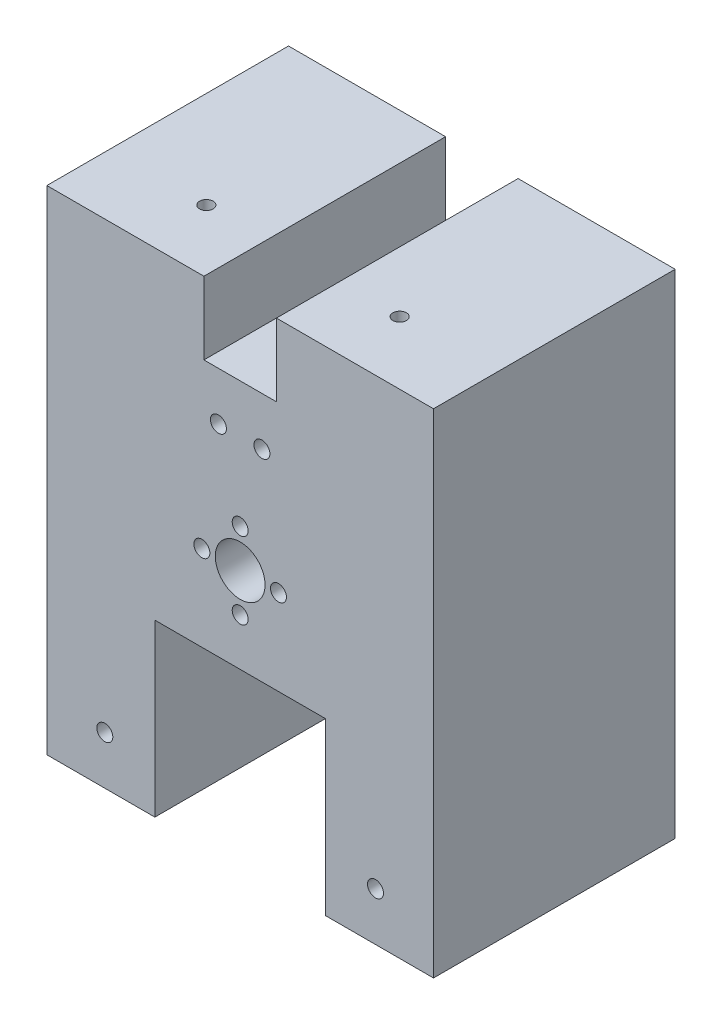
ISO-10303-21;
HEADER;
FILE_DESCRIPTION(('STEP AP214'),'2;1');
FILE_NAME('part.step','',(''),(''),'','','');
FILE_SCHEMA(('AUTOMOTIVE_DESIGN { 1 0 10303 214 1 1 1 1 }'));
ENDSEC;
DATA;
#1=APPLICATION_CONTEXT('core data for automotive mechanical design processes');
#2=APPLICATION_PROTOCOL_DEFINITION('international standard','automotive_design',2000,#1);
#3=PRODUCT_CONTEXT('',#1,'mechanical');
#4=PRODUCT('Part','Part','',(#3));
#5=PRODUCT_RELATED_PRODUCT_CATEGORY('part','',(#4));
#6=PRODUCT_DEFINITION_FORMATION('','',#4);
#7=PRODUCT_DEFINITION_CONTEXT('part definition',#1,'design');
#8=PRODUCT_DEFINITION('design','',#6,#7);
#9=PRODUCT_DEFINITION_SHAPE('','',#8);
#10=(LENGTH_UNIT() NAMED_UNIT(*) SI_UNIT(.MILLI.,.METRE.));
#11=(NAMED_UNIT(*) PLANE_ANGLE_UNIT() SI_UNIT($,.RADIAN.));
#12=(NAMED_UNIT(*) SI_UNIT($,.STERADIAN.) SOLID_ANGLE_UNIT());
#13=UNCERTAINTY_MEASURE_WITH_UNIT(LENGTH_MEASURE(1.E-05),#10,'distance_accuracy_value','');
#14=(GEOMETRIC_REPRESENTATION_CONTEXT(3) GLOBAL_UNCERTAINTY_ASSIGNED_CONTEXT((#13)) GLOBAL_UNIT_ASSIGNED_CONTEXT((#10,
#11,#12)) REPRESENTATION_CONTEXT('',''));
#15=CARTESIAN_POINT('',(0.,0.,0.));
#16=DIRECTION('',(0.,0.,1.));
#17=DIRECTION('',(1.,0.,0.));
#18=AXIS2_PLACEMENT_3D('',#15,#16,#17);
#19=CARTESIAN_POINT('',(-40.,-50.25,-9950.));
#20=DIRECTION('',(0.,1.,0.));
#21=DIRECTION('',(0.,0.,1.));
#22=AXIS2_PLACEMENT_3D('',#19,#20,#21);
#23=PLANE('',#22);
#24=DIRECTION('',(0.,0.,1.));
#25=VECTOR('',#24,1.);
#26=CARTESIAN_POINT('',(17.65,-50.25,-950.));
#27=LINE('',#26,#25);
#28=CARTESIAN_POINT('',(17.65,-50.25,0.));
#29=VERTEX_POINT('',#28);
#30=CARTESIAN_POINT('',(17.65,-50.25,50.));
#31=VERTEX_POINT('',#30);
#32=EDGE_CURVE('E152',#29,#31,#27,.T.);
#33=ORIENTED_EDGE('',*,*,#32,.F.);
#34=DIRECTION('',(1.,0.,0.));
#35=VECTOR('',#34,1.);
#36=CARTESIAN_POINT('',(0.,-50.25,0.));
#37=LINE('',#36,#35);
#38=CARTESIAN_POINT('',(40.,-50.25,0.));
#39=VERTEX_POINT('',#38);
#40=EDGE_CURVE('E298',#29,#39,#37,.T.);
#41=ORIENTED_EDGE('',*,*,#40,.T.);
#42=DIRECTION('',(0.,0.,1.));
#43=VECTOR('',#42,1.);
#44=CARTESIAN_POINT('',(40.,-50.25,-9950.));
#45=LINE('',#44,#43);
#46=CARTESIAN_POINT('',(40.,-50.25,50.));
#47=VERTEX_POINT('',#46);
#48=EDGE_CURVE('E178',#39,#47,#45,.T.);
#49=ORIENTED_EDGE('',*,*,#48,.T.);
#50=DIRECTION('',(-1.,0.,0.));
#51=VECTOR('',#50,1.);
#52=CARTESIAN_POINT('',(-40.,-50.25,50.));
#53=LINE('',#52,#51);
#54=EDGE_CURVE('E174',#47,#31,#53,.T.);
#55=ORIENTED_EDGE('',*,*,#54,.T.);
#56=EDGE_LOOP('',(#33,#41,#49,#55));
#57=FACE_BOUND('',#56,.T.);
#58=ADVANCED_FACE('F44',(#57),#23,.F.);
#59=CARTESIAN_POINT('',(0.,0.,50.));
#60=DIRECTION('',(0.,0.,-1.));
#61=DIRECTION('',(-1.,0.,0.));
#62=AXIS2_PLACEMENT_3D('',#59,#60,#61);
#63=PLANE('',#62);
#64=CARTESIAN_POINT('',(28.,-40.25,50.));
#65=DIRECTION('',(0.,0.,1.));
#66=DIRECTION('',(1.,0.,0.));
#67=AXIS2_PLACEMENT_3D('',#64,#65,#66);
#68=CIRCLE('',#67,1.65);
#69=CARTESIAN_POINT('',(29.65,-40.25,50.));
#70=VERTEX_POINT('',#69);
#71=EDGE_CURVE('E314',#70,#70,#68,.T.);
#72=ORIENTED_EDGE('',*,*,#71,.F.);
#73=EDGE_LOOP('',(#72));
#74=FACE_BOUND('',#73,.T.);
#75=CARTESIAN_POINT('',(-28.,-40.25,50.));
#76=DIRECTION('',(0.,0.,1.));
#77=DIRECTION('',(1.,0.,0.));
#78=AXIS2_PLACEMENT_3D('',#75,#76,#77);
#79=CIRCLE('',#78,1.65);
#80=CARTESIAN_POINT('',(-26.35,-40.25,50.));
#81=VERTEX_POINT('',#80);
#82=EDGE_CURVE('E322',#81,#81,#79,.T.);
#83=ORIENTED_EDGE('',*,*,#82,.F.);
#84=EDGE_LOOP('',(#83));
#85=FACE_BOUND('',#84,.T.);
#86=CARTESIAN_POINT('',(0.,2.75,50.));
#87=DIRECTION('',(0.,0.,1.));
#88=DIRECTION('',(1.,0.,0.));
#89=AXIS2_PLACEMENT_3D('',#86,#87,#88);
#90=CIRCLE('',#89,5.15);
#91=CARTESIAN_POINT('',(5.15,2.75,50.));
#92=VERTEX_POINT('',#91);
#93=EDGE_CURVE('E181',#92,#92,#90,.T.);
#94=ORIENTED_EDGE('',*,*,#93,.F.);
#95=EDGE_LOOP('',(#94));
#96=FACE_BOUND('',#95,.T.);
#97=CARTESIAN_POINT('',(4.5,26.75,50.));
#98=DIRECTION('',(0.,0.,1.));
#99=DIRECTION('',(1.,0.,0.));
#100=AXIS2_PLACEMENT_3D('',#97,#98,#99);
#101=CIRCLE('',#100,1.65);
#102=CARTESIAN_POINT('',(6.15,26.75,50.));
#103=VERTEX_POINT('',#102);
#104=EDGE_CURVE('E189',#103,#103,#101,.T.);
#105=ORIENTED_EDGE('',*,*,#104,.F.);
#106=EDGE_LOOP('',(#105));
#107=FACE_BOUND('',#106,.T.);
#108=CARTESIAN_POINT('',(-4.5,26.75,50.));
#109=DIRECTION('',(0.,0.,1.));
#110=DIRECTION('',(1.,0.,0.));
#111=AXIS2_PLACEMENT_3D('',#108,#109,#110);
#112=CIRCLE('',#111,1.65);
#113=CARTESIAN_POINT('',(-2.85,26.75,50.));
#114=VERTEX_POINT('',#113);
#115=EDGE_CURVE('E194',#114,#114,#112,.T.);
#116=ORIENTED_EDGE('',*,*,#115,.F.);
#117=EDGE_LOOP('',(#116));
#118=FACE_BOUND('',#117,.T.);
#119=CARTESIAN_POINT('',(0.,-5.175,50.));
#120=DIRECTION('',(0.,0.,1.));
#121=DIRECTION('',(1.,0.,0.));
#122=AXIS2_PLACEMENT_3D('',#119,#120,#121);
#123=CIRCLE('',#122,1.65);
#124=CARTESIAN_POINT('',(1.65,-5.175,50.));
#125=VERTEX_POINT('',#124);
#126=EDGE_CURVE('E214',#125,#125,#123,.T.);
#127=ORIENTED_EDGE('',*,*,#126,.F.);
#128=EDGE_LOOP('',(#127));
#129=FACE_BOUND('',#128,.T.);
#130=CARTESIAN_POINT('',(0.,10.675,50.));
#131=DIRECTION('',(0.,0.,1.));
#132=DIRECTION('',(1.,0.,0.));
#133=AXIS2_PLACEMENT_3D('',#130,#131,#132);
#134=CIRCLE('',#133,1.65);
#135=CARTESIAN_POINT('',(1.65,10.675,50.));
#136=VERTEX_POINT('',#135);
#137=EDGE_CURVE('E235',#136,#136,#134,.T.);
#138=ORIENTED_EDGE('',*,*,#137,.F.);
#139=EDGE_LOOP('',(#138));
#140=FACE_BOUND('',#139,.T.);
#141=CARTESIAN_POINT('',(-7.925,2.75,50.));
#142=DIRECTION('',(0.,0.,1.));
#143=DIRECTION('',(1.,0.,0.));
#144=AXIS2_PLACEMENT_3D('',#141,#142,#143);
#145=CIRCLE('',#144,1.65);
#146=CARTESIAN_POINT('',(-6.275,2.75,50.));
#147=VERTEX_POINT('',#146);
#148=EDGE_CURVE('E226',#147,#147,#145,.T.);
#149=ORIENTED_EDGE('',*,*,#148,.F.);
#150=EDGE_LOOP('',(#149));
#151=FACE_BOUND('',#150,.T.);
#152=CARTESIAN_POINT('',(7.925,2.75,50.));
#153=DIRECTION('',(0.,0.,1.));
#154=DIRECTION('',(1.,0.,0.));
#155=AXIS2_PLACEMENT_3D('',#152,#153,#154);
#156=CIRCLE('',#155,1.65);
#157=CARTESIAN_POINT('',(9.575,2.75,50.));
#158=VERTEX_POINT('',#157);
#159=EDGE_CURVE('E221',#158,#158,#156,.T.);
#160=ORIENTED_EDGE('',*,*,#159,.F.);
#161=EDGE_LOOP('',(#160));
#162=FACE_BOUND('',#161,.T.);
#163=DIRECTION('',(0.,1.,0.));
#164=VECTOR('',#163,1.);
#165=CARTESIAN_POINT('',(17.65,-14.95,50.));
#166=LINE('',#165,#164);
#167=CARTESIAN_POINT('',(17.65,-14.95,50.));
#168=VERTEX_POINT('',#167);
#169=EDGE_CURVE('E148',#31,#168,#166,.T.);
#170=ORIENTED_EDGE('',*,*,#169,.F.);
#171=ORIENTED_EDGE('',*,*,#54,.F.);
#172=DIRECTION('',(0.,1.,0.));
#173=VECTOR('',#172,1.);
#174=CARTESIAN_POINT('',(40.,-51.75,50.));
#175=LINE('',#174,#173);
#176=CARTESIAN_POINT('',(40.,51.75,50.));
#177=VERTEX_POINT('',#176);
#178=EDGE_CURVE('E237',#47,#177,#175,.T.);
#179=ORIENTED_EDGE('',*,*,#178,.T.);
#180=DIRECTION('',(-1.,0.,0.));
#181=VECTOR('',#180,1.);
#182=CARTESIAN_POINT('',(-40.,51.75,50.));
#183=LINE('',#182,#181);
#184=CARTESIAN_POINT('',(7.49999999999998,51.75,50.));
#185=VERTEX_POINT('',#184);
#186=EDGE_CURVE('E242',#177,#185,#183,.T.);
#187=ORIENTED_EDGE('',*,*,#186,.T.);
#188=DIRECTION('',(0.,1.,0.));
#189=VECTOR('',#188,1.);
#190=CARTESIAN_POINT('',(7.49999999999998,36.75,50.));
#191=LINE('',#190,#189);
#192=CARTESIAN_POINT('',(7.49999999999998,36.75,50.));
#193=VERTEX_POINT('',#192);
#194=EDGE_CURVE('E197',#193,#185,#191,.T.);
#195=ORIENTED_EDGE('',*,*,#194,.F.);
#196=DIRECTION('',(1.,0.,0.));
#197=VECTOR('',#196,1.);
#198=CARTESIAN_POINT('',(-7.50000000000002,36.75,50.));
#199=LINE('',#198,#197);
#200=CARTESIAN_POINT('',(-7.50000000000002,36.75,50.));
#201=VERTEX_POINT('',#200);
#202=EDGE_CURVE('E202',#201,#193,#199,.T.);
#203=ORIENTED_EDGE('',*,*,#202,.F.);
#204=DIRECTION('',(0.,-1.,0.));
#205=VECTOR('',#204,1.);
#206=CARTESIAN_POINT('',(-7.50000000000002,36.75,50.));
#207=LINE('',#206,#205);
#208=CARTESIAN_POINT('',(-7.50000000000002,51.75,50.));
#209=VERTEX_POINT('',#208);
#210=EDGE_CURVE('E200',#209,#201,#207,.T.);
#211=ORIENTED_EDGE('',*,*,#210,.F.);
#212=CARTESIAN_POINT('',(-40.,51.75,50.));
#213=VERTEX_POINT('',#212);
#214=EDGE_CURVE('E245',#209,#213,#183,.T.);
#215=ORIENTED_EDGE('',*,*,#214,.T.);
#216=DIRECTION('',(0.,-1.,0.));
#217=VECTOR('',#216,1.);
#218=CARTESIAN_POINT('',(-40.,-51.75,50.));
#219=LINE('',#218,#217);
#220=CARTESIAN_POINT('',(-40.,-50.25,50.));
#221=VERTEX_POINT('',#220);
#222=EDGE_CURVE('E247',#213,#221,#219,.T.);
#223=ORIENTED_EDGE('',*,*,#222,.T.);
#224=CARTESIAN_POINT('',(-17.65,-50.25,50.));
#225=VERTEX_POINT('',#224);
#226=EDGE_CURVE('E166',#225,#221,#53,.T.);
#227=ORIENTED_EDGE('',*,*,#226,.F.);
#228=DIRECTION('',(0.,-1.,0.));
#229=VECTOR('',#228,1.);
#230=CARTESIAN_POINT('',(-17.65,-14.95,50.));
#231=LINE('',#230,#229);
#232=CARTESIAN_POINT('',(-17.65,-14.95,50.));
#233=VERTEX_POINT('',#232);
#234=EDGE_CURVE('E146',#233,#225,#231,.T.);
#235=ORIENTED_EDGE('',*,*,#234,.F.);
#236=DIRECTION('',(-1.,0.,0.));
#237=VECTOR('',#236,1.);
#238=CARTESIAN_POINT('',(-17.65,-14.95,50.));
#239=LINE('',#238,#237);
#240=EDGE_CURVE('E139',#168,#233,#239,.T.);
#241=ORIENTED_EDGE('',*,*,#240,.F.);
#242=EDGE_LOOP('',(#170,#171,#179,#187,#195,#203,#211,#215,#223,#227,#235,#241));
#243=FACE_BOUND('',#242,.T.);
#244=ADVANCED_FACE('F156',(#74,#85,#96,#107,#118,#129,#140,#151,#162,#243),#63,.F.);
#245=CARTESIAN_POINT('',(40.,-51.75,50.));
#246=DIRECTION('',(-1.,0.,0.));
#247=DIRECTION('',(0.,0.,1.));
#248=AXIS2_PLACEMENT_3D('',#245,#246,#247);
#249=PLANE('',#248);
#250=ORIENTED_EDGE('',*,*,#48,.F.);
#251=DIRECTION('',(0.,1.,0.));
#252=VECTOR('',#251,1.);
#253=CARTESIAN_POINT('',(40.,-51.75,0.));
#254=LINE('',#253,#252);
#255=CARTESIAN_POINT('',(40.,51.75,0.));
#256=VERTEX_POINT('',#255);
#257=EDGE_CURVE('E254',#39,#256,#254,.T.);
#258=ORIENTED_EDGE('',*,*,#257,.T.);
#259=DIRECTION('',(0.,0.,-1.));
#260=VECTOR('',#259,1.);
#261=CARTESIAN_POINT('',(40.,51.75,50.));
#262=LINE('',#261,#260);
#263=EDGE_CURVE('E266',#177,#256,#262,.T.);
#264=ORIENTED_EDGE('',*,*,#263,.F.);
#265=ORIENTED_EDGE('',*,*,#178,.F.);
#266=EDGE_LOOP('',(#250,#258,#264,#265));
#267=FACE_BOUND('',#266,.T.);
#268=ADVANCED_FACE('F50',(#267),#249,.F.);
#269=CARTESIAN_POINT('',(-40.,51.75,50.));
#270=DIRECTION('',(0.,-1.,0.));
#271=DIRECTION('',(0.,0.,-1.));
#272=AXIS2_PLACEMENT_3D('',#269,#270,#271);
#273=PLANE('',#272);
#274=CARTESIAN_POINT('',(-20.,51.75,37.));
#275=DIRECTION('',(0.,1.,0.));
#276=DIRECTION('',(0.,0.,1.));
#277=AXIS2_PLACEMENT_3D('',#274,#275,#276);
#278=CIRCLE('',#277,1.4);
#279=CARTESIAN_POINT('',(-20.,51.75,38.4));
#280=VERTEX_POINT('',#279);
#281=EDGE_CURVE('E334',#280,#280,#278,.T.);
#282=ORIENTED_EDGE('',*,*,#281,.F.);
#283=EDGE_LOOP('',(#282));
#284=FACE_BOUND('',#283,.T.);
#285=DIRECTION('',(0.,0.,1.));
#286=VECTOR('',#285,1.);
#287=CARTESIAN_POINT('',(-7.50000000000002,51.75,-50.));
#288=LINE('',#287,#286);
#289=CARTESIAN_POINT('',(-7.50000000000002,51.75,0.));
#290=VERTEX_POINT('',#289);
#291=EDGE_CURVE('E217',#290,#209,#288,.T.);
#292=ORIENTED_EDGE('',*,*,#291,.F.);
#293=DIRECTION('',(-1.,0.,0.));
#294=VECTOR('',#293,1.);
#295=CARTESIAN_POINT('',(-40.,51.75,0.));
#296=LINE('',#295,#294);
#297=CARTESIAN_POINT('',(-40.,51.75,0.));
#298=VERTEX_POINT('',#297);
#299=EDGE_CURVE('E256',#290,#298,#296,.T.);
#300=ORIENTED_EDGE('',*,*,#299,.T.);
#301=DIRECTION('',(0.,0.,-1.));
#302=VECTOR('',#301,1.);
#303=CARTESIAN_POINT('',(-40.,51.75,50.));
#304=LINE('',#303,#302);
#305=EDGE_CURVE('E255',#213,#298,#304,.T.);
#306=ORIENTED_EDGE('',*,*,#305,.F.);
#307=ORIENTED_EDGE('',*,*,#214,.F.);
#308=EDGE_LOOP('',(#292,#300,#306,#307));
#309=FACE_BOUND('',#308,.T.);
#310=ADVANCED_FACE('F360',(#284,#309),#273,.F.);
#311=CARTESIAN_POINT('',(20.,51.75,37.));
#312=DIRECTION('',(0.,1.,0.));
#313=DIRECTION('',(0.,0.,1.));
#314=AXIS2_PLACEMENT_3D('',#311,#312,#313);
#315=CIRCLE('',#314,1.4);
#316=CARTESIAN_POINT('',(20.,51.75,38.4));
#317=VERTEX_POINT('',#316);
#318=EDGE_CURVE('E336',#317,#317,#315,.T.);
#319=ORIENTED_EDGE('',*,*,#318,.F.);
#320=EDGE_LOOP('',(#319));
#321=FACE_BOUND('',#320,.T.);
#322=CARTESIAN_POINT('',(7.49999999999998,51.75,0.));
#323=VERTEX_POINT('',#322);
#324=EDGE_CURVE('E259',#256,#323,#296,.T.);
#325=ORIENTED_EDGE('',*,*,#324,.T.);
#326=DIRECTION('',(0.,0.,1.));
#327=VECTOR('',#326,1.);
#328=CARTESIAN_POINT('',(7.49999999999998,51.75,-50.));
#329=LINE('',#328,#327);
#330=EDGE_CURVE('E209',#323,#185,#329,.T.);
#331=ORIENTED_EDGE('',*,*,#330,.T.);
#332=ORIENTED_EDGE('',*,*,#186,.F.);
#333=ORIENTED_EDGE('',*,*,#263,.T.);
#334=EDGE_LOOP('',(#325,#331,#332,#333));
#335=FACE_BOUND('',#334,.T.);
#336=ADVANCED_FACE('F352',(#321,#335),#273,.F.);
#337=CARTESIAN_POINT('',(-40.,-51.75,50.));
#338=DIRECTION('',(1.,0.,0.));
#339=DIRECTION('',(0.,0.,-1.));
#340=AXIS2_PLACEMENT_3D('',#337,#338,#339);
#341=PLANE('',#340);
#342=DIRECTION('',(0.,-1.,0.));
#343=VECTOR('',#342,1.);
#344=CARTESIAN_POINT('',(-40.,-51.75,0.));
#345=LINE('',#344,#343);
#346=CARTESIAN_POINT('',(-40.,-50.25,0.));
#347=VERTEX_POINT('',#346);
#348=EDGE_CURVE('E243',#298,#347,#345,.T.);
#349=ORIENTED_EDGE('',*,*,#348,.T.);
#350=DIRECTION('',(0.,0.,1.));
#351=VECTOR('',#350,1.);
#352=CARTESIAN_POINT('',(-40.,-50.25,-9950.));
#353=LINE('',#352,#351);
#354=EDGE_CURVE('E73',#347,#221,#353,.T.);
#355=ORIENTED_EDGE('',*,*,#354,.T.);
#356=ORIENTED_EDGE('',*,*,#222,.F.);
#357=ORIENTED_EDGE('',*,*,#305,.T.);
#358=EDGE_LOOP('',(#349,#355,#356,#357));
#359=FACE_BOUND('',#358,.T.);
#360=ADVANCED_FACE('F356',(#359),#341,.F.);
#361=CARTESIAN_POINT('',(0.,0.,0.));
#362=DIRECTION('',(0.,0.,-1.));
#363=DIRECTION('',(-1.,0.,0.));
#364=AXIS2_PLACEMENT_3D('',#361,#362,#363);
#365=PLANE('',#364);
#366=CARTESIAN_POINT('',(28.,-40.25,0.));
#367=DIRECTION('',(0.,0.,-1.));
#368=DIRECTION('',(-1.,0.,0.));
#369=AXIS2_PLACEMENT_3D('',#366,#367,#368);
#370=CIRCLE('',#369,1.65);
#371=CARTESIAN_POINT('',(26.35,-40.25,0.));
#372=VERTEX_POINT('',#371);
#373=EDGE_CURVE('E47',#372,#372,#370,.T.);
#374=ORIENTED_EDGE('',*,*,#373,.F.);
#375=EDGE_LOOP('',(#374));
#376=FACE_BOUND('',#375,.T.);
#377=CARTESIAN_POINT('',(-28.,-40.25,0.));
#378=DIRECTION('',(0.,0.,-1.));
#379=DIRECTION('',(-1.,0.,0.));
#380=AXIS2_PLACEMENT_3D('',#377,#378,#379);
#381=CIRCLE('',#380,1.65);
#382=CARTESIAN_POINT('',(-29.65,-40.25,0.));
#383=VERTEX_POINT('',#382);
#384=EDGE_CURVE('E315',#383,#383,#381,.T.);
#385=ORIENTED_EDGE('',*,*,#384,.F.);
#386=EDGE_LOOP('',(#385));
#387=FACE_BOUND('',#386,.T.);
#388=DIRECTION('',(0.,-1.,0.));
#389=VECTOR('',#388,1.);
#390=CARTESIAN_POINT('',(17.65,0.,0.));
#391=LINE('',#390,#389);
#392=CARTESIAN_POINT('',(17.65,-14.95,0.));
#393=VERTEX_POINT('',#392);
#394=EDGE_CURVE('E11',#393,#29,#391,.T.);
#395=ORIENTED_EDGE('',*,*,#394,.F.);
#396=DIRECTION('',(1.,0.,0.));
#397=VECTOR('',#396,1.);
#398=CARTESIAN_POINT('',(0.,-14.95,0.));
#399=LINE('',#398,#397);
#400=CARTESIAN_POINT('',(-17.65,-14.95,0.));
#401=VERTEX_POINT('',#400);
#402=EDGE_CURVE('E145',#401,#393,#399,.T.);
#403=ORIENTED_EDGE('',*,*,#402,.F.);
#404=DIRECTION('',(0.,1.,0.));
#405=VECTOR('',#404,1.);
#406=CARTESIAN_POINT('',(-17.65,0.,0.));
#407=LINE('',#406,#405);
#408=CARTESIAN_POINT('',(-17.65,-50.25,0.));
#409=VERTEX_POINT('',#408);
#410=EDGE_CURVE('E54',#409,#401,#407,.T.);
#411=ORIENTED_EDGE('',*,*,#410,.F.);
#412=EDGE_CURVE('E306',#347,#409,#37,.T.);
#413=ORIENTED_EDGE('',*,*,#412,.F.);
#414=ORIENTED_EDGE('',*,*,#348,.F.);
#415=ORIENTED_EDGE('',*,*,#299,.F.);
#416=DIRECTION('',(0.,1.,0.));
#417=VECTOR('',#416,1.);
#418=CARTESIAN_POINT('',(-7.50000000000002,0.,0.));
#419=LINE('',#418,#417);
#420=CARTESIAN_POINT('',(-7.50000000000002,36.75,0.));
#421=VERTEX_POINT('',#420);
#422=EDGE_CURVE('E275',#421,#290,#419,.T.);
#423=ORIENTED_EDGE('',*,*,#422,.F.);
#424=DIRECTION('',(-1.,0.,0.));
#425=VECTOR('',#424,1.);
#426=CARTESIAN_POINT('',(0.,36.75,0.));
#427=LINE('',#426,#425);
#428=CARTESIAN_POINT('',(7.49999999999998,36.75,0.));
#429=VERTEX_POINT('',#428);
#430=EDGE_CURVE('E289',#429,#421,#427,.T.);
#431=ORIENTED_EDGE('',*,*,#430,.F.);
#432=DIRECTION('',(0.,-1.,0.));
#433=VECTOR('',#432,1.);
#434=CARTESIAN_POINT('',(7.49999999999998,0.,0.));
#435=LINE('',#434,#433);
#436=EDGE_CURVE('E291',#323,#429,#435,.T.);
#437=ORIENTED_EDGE('',*,*,#436,.F.);
#438=ORIENTED_EDGE('',*,*,#324,.F.);
#439=ORIENTED_EDGE('',*,*,#257,.F.);
#440=ORIENTED_EDGE('',*,*,#40,.F.);
#441=EDGE_LOOP('',(#395,#403,#411,#413,#414,#415,#423,#431,#437,#438,#439,#440));
#442=FACE_BOUND('',#441,.T.);
#443=CARTESIAN_POINT('',(0.,2.75,0.));
#444=DIRECTION('',(0.,0.,-1.));
#445=DIRECTION('',(-1.,0.,0.));
#446=AXIS2_PLACEMENT_3D('',#443,#444,#445);
#447=CIRCLE('',#446,5.15);
#448=CARTESIAN_POINT('',(-5.15,2.75,0.));
#449=VERTEX_POINT('',#448);
#450=EDGE_CURVE('E190',#449,#449,#447,.T.);
#451=ORIENTED_EDGE('',*,*,#450,.F.);
#452=EDGE_LOOP('',(#451));
#453=FACE_BOUND('',#452,.T.);
#454=CARTESIAN_POINT('',(4.5,26.75,0.));
#455=DIRECTION('',(0.,0.,-1.));
#456=DIRECTION('',(-1.,0.,0.));
#457=AXIS2_PLACEMENT_3D('',#454,#455,#456);
#458=CIRCLE('',#457,1.65);
#459=CARTESIAN_POINT('',(2.85,26.75,0.));
#460=VERTEX_POINT('',#459);
#461=EDGE_CURVE('E203',#460,#460,#458,.T.);
#462=ORIENTED_EDGE('',*,*,#461,.F.);
#463=EDGE_LOOP('',(#462));
#464=FACE_BOUND('',#463,.T.);
#465=CARTESIAN_POINT('',(-4.5,26.75,0.));
#466=DIRECTION('',(0.,0.,-1.));
#467=DIRECTION('',(-1.,0.,0.));
#468=AXIS2_PLACEMENT_3D('',#465,#466,#467);
#469=CIRCLE('',#468,1.65);
#470=CARTESIAN_POINT('',(-6.15,26.75,0.));
#471=VERTEX_POINT('',#470);
#472=EDGE_CURVE('E192',#471,#471,#469,.T.);
#473=ORIENTED_EDGE('',*,*,#472,.F.);
#474=EDGE_LOOP('',(#473));
#475=FACE_BOUND('',#474,.T.);
#476=CARTESIAN_POINT('',(7.925,2.75,0.));
#477=DIRECTION('',(0.,0.,-1.));
#478=DIRECTION('',(-1.,0.,0.));
#479=AXIS2_PLACEMENT_3D('',#476,#477,#478);
#480=CIRCLE('',#479,1.65);
#481=CARTESIAN_POINT('',(6.275,2.75,0.));
#482=VERTEX_POINT('',#481);
#483=EDGE_CURVE('E257',#482,#482,#480,.T.);
#484=ORIENTED_EDGE('',*,*,#483,.F.);
#485=EDGE_LOOP('',(#484));
#486=FACE_BOUND('',#485,.T.);
#487=CARTESIAN_POINT('',(-7.925,2.75,0.));
#488=DIRECTION('',(0.,0.,-1.));
#489=DIRECTION('',(-1.,0.,0.));
#490=AXIS2_PLACEMENT_3D('',#487,#488,#489);
#491=CIRCLE('',#490,1.65);
#492=CARTESIAN_POINT('',(-9.575,2.75,0.));
#493=VERTEX_POINT('',#492);
#494=EDGE_CURVE('E280',#493,#493,#491,.T.);
#495=ORIENTED_EDGE('',*,*,#494,.F.);
#496=EDGE_LOOP('',(#495));
#497=FACE_BOUND('',#496,.T.);
#498=CARTESIAN_POINT('',(0.,10.675,0.));
#499=DIRECTION('',(0.,0.,-1.));
#500=DIRECTION('',(-1.,0.,0.));
#501=AXIS2_PLACEMENT_3D('',#498,#499,#500);
#502=CIRCLE('',#501,1.65);
#503=CARTESIAN_POINT('',(-1.65,10.675,0.));
#504=VERTEX_POINT('',#503);
#505=EDGE_CURVE('E276',#504,#504,#502,.T.);
#506=ORIENTED_EDGE('',*,*,#505,.F.);
#507=EDGE_LOOP('',(#506));
#508=FACE_BOUND('',#507,.T.);
#509=CARTESIAN_POINT('',(0.,-5.175,0.));
#510=DIRECTION('',(0.,0.,-1.));
#511=DIRECTION('',(-1.,0.,0.));
#512=AXIS2_PLACEMENT_3D('',#509,#510,#511);
#513=CIRCLE('',#512,1.65);
#514=CARTESIAN_POINT('',(-1.65,-5.175,0.));
#515=VERTEX_POINT('',#514);
#516=EDGE_CURVE('E227',#515,#515,#513,.T.);
#517=ORIENTED_EDGE('',*,*,#516,.F.);
#518=EDGE_LOOP('',(#517));
#519=FACE_BOUND('',#518,.T.);
#520=ADVANCED_FACE('F366',(#376,#387,#442,#453,#464,#475,#486,#497,#508,#519),#365,.T.);
#521=CARTESIAN_POINT('',(0.,-5.175,-9.99999999999999));
#522=DIRECTION('',(0.,0.,1.));
#523=DIRECTION('',(1.,0.,0.));
#524=AXIS2_PLACEMENT_3D('',#521,#522,#523);
#525=CYLINDRICAL_SURFACE('',#524,1.65);
#526=ORIENTED_EDGE('',*,*,#516,.T.);
#527=EDGE_LOOP('',(#526));
#528=FACE_BOUND('',#527,.T.);
#529=ORIENTED_EDGE('',*,*,#126,.T.);
#530=EDGE_LOOP('',(#529));
#531=FACE_BOUND('',#530,.T.);
#532=ADVANCED_FACE('F456',(#528,#531),#525,.F.);
#533=CARTESIAN_POINT('',(0.,10.675,-9.99999999999999));
#534=DIRECTION('',(0.,0.,1.));
#535=DIRECTION('',(1.,0.,0.));
#536=AXIS2_PLACEMENT_3D('',#533,#534,#535);
#537=CYLINDRICAL_SURFACE('',#536,1.65);
#538=ORIENTED_EDGE('',*,*,#505,.T.);
#539=EDGE_LOOP('',(#538));
#540=FACE_BOUND('',#539,.T.);
#541=ORIENTED_EDGE('',*,*,#137,.T.);
#542=EDGE_LOOP('',(#541));
#543=FACE_BOUND('',#542,.T.);
#544=ADVANCED_FACE('F452',(#540,#543),#537,.F.);
#545=CARTESIAN_POINT('',(-7.925,2.75,-9.99999999999999));
#546=DIRECTION('',(0.,0.,1.));
#547=DIRECTION('',(1.,0.,0.));
#548=AXIS2_PLACEMENT_3D('',#545,#546,#547);
#549=CYLINDRICAL_SURFACE('',#548,1.65);
#550=ORIENTED_EDGE('',*,*,#494,.T.);
#551=EDGE_LOOP('',(#550));
#552=FACE_BOUND('',#551,.T.);
#553=ORIENTED_EDGE('',*,*,#148,.T.);
#554=EDGE_LOOP('',(#553));
#555=FACE_BOUND('',#554,.T.);
#556=ADVANCED_FACE('F449',(#552,#555),#549,.F.);
#557=CARTESIAN_POINT('',(7.925,2.75,-9.99999999999999));
#558=DIRECTION('',(0.,0.,1.));
#559=DIRECTION('',(1.,0.,0.));
#560=AXIS2_PLACEMENT_3D('',#557,#558,#559);
#561=CYLINDRICAL_SURFACE('',#560,1.65);
#562=ORIENTED_EDGE('',*,*,#483,.T.);
#563=EDGE_LOOP('',(#562));
#564=FACE_BOUND('',#563,.T.);
#565=ORIENTED_EDGE('',*,*,#159,.T.);
#566=EDGE_LOOP('',(#565));
#567=FACE_BOUND('',#566,.T.);
#568=ADVANCED_FACE('F444',(#564,#567),#561,.F.);
#569=CARTESIAN_POINT('',(7.49999999999998,36.75,-50.));
#570=DIRECTION('',(1.,0.,0.));
#571=DIRECTION('',(0.,0.,-1.));
#572=AXIS2_PLACEMENT_3D('',#569,#570,#571);
#573=PLANE('',#572);
#574=ORIENTED_EDGE('',*,*,#436,.T.);
#575=DIRECTION('',(0.,0.,1.));
#576=VECTOR('',#575,1.);
#577=CARTESIAN_POINT('',(7.49999999999998,36.75,-50.));
#578=LINE('',#577,#576);
#579=EDGE_CURVE('E208',#429,#193,#578,.T.);
#580=ORIENTED_EDGE('',*,*,#579,.T.);
#581=ORIENTED_EDGE('',*,*,#194,.T.);
#582=ORIENTED_EDGE('',*,*,#330,.F.);
#583=EDGE_LOOP('',(#574,#580,#581,#582));
#584=FACE_BOUND('',#583,.T.);
#585=ADVANCED_FACE('F373',(#584),#573,.F.);
#586=CARTESIAN_POINT('',(-7.50000000000002,36.75,-50.));
#587=DIRECTION('',(0.,-1.,0.));
#588=DIRECTION('',(0.,0.,-1.));
#589=AXIS2_PLACEMENT_3D('',#586,#587,#588);
#590=PLANE('',#589);
#591=ORIENTED_EDGE('',*,*,#430,.T.);
#592=DIRECTION('',(0.,0.,1.));
#593=VECTOR('',#592,1.);
#594=CARTESIAN_POINT('',(-7.50000000000002,36.75,-50.));
#595=LINE('',#594,#593);
#596=EDGE_CURVE('E213',#421,#201,#595,.T.);
#597=ORIENTED_EDGE('',*,*,#596,.T.);
#598=ORIENTED_EDGE('',*,*,#202,.T.);
#599=ORIENTED_EDGE('',*,*,#579,.F.);
#600=EDGE_LOOP('',(#591,#597,#598,#599));
#601=FACE_BOUND('',#600,.T.);
#602=ADVANCED_FACE('F374',(#601),#590,.F.);
#603=CARTESIAN_POINT('',(-7.50000000000002,36.75,-50.));
#604=DIRECTION('',(-1.,0.,0.));
#605=DIRECTION('',(0.,0.,1.));
#606=AXIS2_PLACEMENT_3D('',#603,#604,#605);
#607=PLANE('',#606);
#608=ORIENTED_EDGE('',*,*,#422,.T.);
#609=ORIENTED_EDGE('',*,*,#291,.T.);
#610=ORIENTED_EDGE('',*,*,#210,.T.);
#611=ORIENTED_EDGE('',*,*,#596,.F.);
#612=EDGE_LOOP('',(#608,#609,#610,#611));
#613=FACE_BOUND('',#612,.T.);
#614=ADVANCED_FACE('F436',(#613),#607,.F.);
#615=CARTESIAN_POINT('',(-4.5,26.75,-50.));
#616=DIRECTION('',(0.,0.,1.));
#617=DIRECTION('',(1.,0.,0.));
#618=AXIS2_PLACEMENT_3D('',#615,#616,#617);
#619=CYLINDRICAL_SURFACE('',#618,1.65);
#620=ORIENTED_EDGE('',*,*,#472,.T.);
#621=EDGE_LOOP('',(#620));
#622=FACE_BOUND('',#621,.T.);
#623=ORIENTED_EDGE('',*,*,#115,.T.);
#624=EDGE_LOOP('',(#623));
#625=FACE_BOUND('',#624,.T.);
#626=ADVANCED_FACE('F429',(#622,#625),#619,.F.);
#627=CARTESIAN_POINT('',(4.5,26.75,-50.));
#628=DIRECTION('',(0.,0.,1.));
#629=DIRECTION('',(1.,0.,0.));
#630=AXIS2_PLACEMENT_3D('',#627,#628,#629);
#631=CYLINDRICAL_SURFACE('',#630,1.65);
#632=ORIENTED_EDGE('',*,*,#461,.T.);
#633=EDGE_LOOP('',(#632));
#634=FACE_BOUND('',#633,.T.);
#635=ORIENTED_EDGE('',*,*,#104,.T.);
#636=EDGE_LOOP('',(#635));
#637=FACE_BOUND('',#636,.T.);
#638=ADVANCED_FACE('F421',(#634,#637),#631,.F.);
#639=CARTESIAN_POINT('',(0.,2.75,-950.));
#640=DIRECTION('',(0.,0.,1.));
#641=DIRECTION('',(1.,0.,0.));
#642=AXIS2_PLACEMENT_3D('',#639,#640,#641);
#643=CYLINDRICAL_SURFACE('',#642,5.15);
#644=ORIENTED_EDGE('',*,*,#450,.T.);
#645=EDGE_LOOP('',(#644));
#646=FACE_BOUND('',#645,.T.);
#647=ORIENTED_EDGE('',*,*,#93,.T.);
#648=EDGE_LOOP('',(#647));
#649=FACE_BOUND('',#648,.T.);
#650=ADVANCED_FACE('F419',(#646,#649),#643,.F.);
#651=ORIENTED_EDGE('',*,*,#412,.T.);
#652=DIRECTION('',(0.,0.,1.));
#653=VECTOR('',#652,1.);
#654=CARTESIAN_POINT('',(-17.65,-50.25,-950.));
#655=LINE('',#654,#653);
#656=EDGE_CURVE('E169',#409,#225,#655,.T.);
#657=ORIENTED_EDGE('',*,*,#656,.T.);
#658=ORIENTED_EDGE('',*,*,#226,.T.);
#659=ORIENTED_EDGE('',*,*,#354,.F.);
#660=EDGE_LOOP('',(#651,#657,#658,#659));
#661=FACE_BOUND('',#660,.T.);
#662=ADVANCED_FACE('F387',(#661),#23,.F.);
#663=CARTESIAN_POINT('',(17.65,-14.95,-950.));
#664=DIRECTION('',(1.,0.,0.));
#665=DIRECTION('',(0.,1.,0.));
#666=AXIS2_PLACEMENT_3D('',#663,#664,#665);
#667=PLANE('',#666);
#668=ORIENTED_EDGE('',*,*,#394,.T.);
#669=ORIENTED_EDGE('',*,*,#32,.T.);
#670=ORIENTED_EDGE('',*,*,#169,.T.);
#671=DIRECTION('',(0.,0.,1.));
#672=VECTOR('',#671,1.);
#673=CARTESIAN_POINT('',(17.65,-14.95,-950.));
#674=LINE('',#673,#672);
#675=EDGE_CURVE('E135',#393,#168,#674,.T.);
#676=ORIENTED_EDGE('',*,*,#675,.F.);
#677=EDGE_LOOP('',(#668,#669,#670,#676));
#678=FACE_BOUND('',#677,.T.);
#679=ADVANCED_FACE('F150',(#678),#667,.F.);
#680=CARTESIAN_POINT('',(-17.65,-14.95,-950.));
#681=DIRECTION('',(-1.,0.,0.));
#682=DIRECTION('',(0.,-1.,0.));
#683=AXIS2_PLACEMENT_3D('',#680,#681,#682);
#684=PLANE('',#683);
#685=ORIENTED_EDGE('',*,*,#410,.T.);
#686=DIRECTION('',(0.,0.,1.));
#687=VECTOR('',#686,1.);
#688=CARTESIAN_POINT('',(-17.65,-14.95,-950.));
#689=LINE('',#688,#687);
#690=EDGE_CURVE('E64',#401,#233,#689,.T.);
#691=ORIENTED_EDGE('',*,*,#690,.T.);
#692=ORIENTED_EDGE('',*,*,#234,.T.);
#693=ORIENTED_EDGE('',*,*,#656,.F.);
#694=EDGE_LOOP('',(#685,#691,#692,#693));
#695=FACE_BOUND('',#694,.T.);
#696=ADVANCED_FACE('F396',(#695),#684,.F.);
#697=CARTESIAN_POINT('',(-17.65,-14.95,-950.));
#698=DIRECTION('',(0.,1.,0.));
#699=DIRECTION('',(0.,0.,1.));
#700=AXIS2_PLACEMENT_3D('',#697,#698,#699);
#701=PLANE('',#700);
#702=ORIENTED_EDGE('',*,*,#402,.T.);
#703=ORIENTED_EDGE('',*,*,#675,.T.);
#704=ORIENTED_EDGE('',*,*,#240,.T.);
#705=ORIENTED_EDGE('',*,*,#690,.F.);
#706=EDGE_LOOP('',(#702,#703,#704,#705));
#707=FACE_BOUND('',#706,.T.);
#708=ADVANCED_FACE('F140',(#707),#701,.F.);
#709=CARTESIAN_POINT('',(-28.,-40.25,-950.));
#710=DIRECTION('',(0.,0.,1.));
#711=DIRECTION('',(1.,0.,0.));
#712=AXIS2_PLACEMENT_3D('',#709,#710,#711);
#713=CYLINDRICAL_SURFACE('',#712,1.65);
#714=ORIENTED_EDGE('',*,*,#384,.T.);
#715=EDGE_LOOP('',(#714));
#716=FACE_BOUND('',#715,.T.);
#717=ORIENTED_EDGE('',*,*,#82,.T.);
#718=EDGE_LOOP('',(#717));
#719=FACE_BOUND('',#718,.T.);
#720=ADVANCED_FACE('F403',(#716,#719),#713,.F.);
#721=CARTESIAN_POINT('',(28.,-40.25,-950.));
#722=DIRECTION('',(0.,0.,1.));
#723=DIRECTION('',(1.,0.,0.));
#724=AXIS2_PLACEMENT_3D('',#721,#722,#723);
#725=CYLINDRICAL_SURFACE('',#724,1.65);
#726=ORIENTED_EDGE('',*,*,#373,.T.);
#727=EDGE_LOOP('',(#726));
#728=FACE_BOUND('',#727,.T.);
#729=ORIENTED_EDGE('',*,*,#71,.T.);
#730=EDGE_LOOP('',(#729));
#731=FACE_BOUND('',#730,.T.);
#732=ADVANCED_FACE('F353',(#728,#731),#725,.F.);
#733=CARTESIAN_POINT('',(20.,16.75,37.));
#734=DIRECTION('',(0.,1.,0.));
#735=DIRECTION('',(0.,0.,1.));
#736=AXIS2_PLACEMENT_3D('',#733,#734,#735);
#737=CYLINDRICAL_SURFACE('',#736,1.4);
#738=CARTESIAN_POINT('',(20.,16.75,37.));
#739=DIRECTION('',(0.,1.,0.));
#740=DIRECTION('',(0.,0.,1.));
#741=AXIS2_PLACEMENT_3D('',#738,#739,#740);
#742=CIRCLE('',#741,1.4);
#743=CARTESIAN_POINT('',(20.,16.75,38.4));
#744=VERTEX_POINT('',#743);
#745=EDGE_CURVE('E329',#744,#744,#742,.T.);
#746=ORIENTED_EDGE('',*,*,#745,.F.);
#747=EDGE_LOOP('',(#746));
#748=FACE_BOUND('',#747,.T.);
#749=ORIENTED_EDGE('',*,*,#318,.T.);
#750=EDGE_LOOP('',(#749));
#751=FACE_BOUND('',#750,.T.);
#752=ADVANCED_FACE('F349',(#748,#751),#737,.F.);
#753=CARTESIAN_POINT('',(20.,16.75,37.));
#754=DIRECTION('',(0.,1.,0.));
#755=DIRECTION('',(0.,0.,1.));
#756=AXIS2_PLACEMENT_3D('',#753,#754,#755);
#757=PLANE('',#756);
#758=ORIENTED_EDGE('',*,*,#745,.T.);
#759=EDGE_LOOP('',(#758));
#760=FACE_BOUND('',#759,.T.);
#761=ADVANCED_FACE('F346',(#760),#757,.T.);
#762=CARTESIAN_POINT('',(-20.,16.75,37.));
#763=DIRECTION('',(0.,1.,0.));
#764=DIRECTION('',(0.,0.,1.));
#765=AXIS2_PLACEMENT_3D('',#762,#763,#764);
#766=CYLINDRICAL_SURFACE('',#765,1.4);
#767=CARTESIAN_POINT('',(-20.,16.75,37.));
#768=DIRECTION('',(0.,1.,0.));
#769=DIRECTION('',(0.,0.,1.));
#770=AXIS2_PLACEMENT_3D('',#767,#768,#769);
#771=CIRCLE('',#770,1.4);
#772=CARTESIAN_POINT('',(-20.,16.75,38.4));
#773=VERTEX_POINT('',#772);
#774=EDGE_CURVE('E330',#773,#773,#771,.T.);
#775=ORIENTED_EDGE('',*,*,#774,.F.);
#776=EDGE_LOOP('',(#775));
#777=FACE_BOUND('',#776,.T.);
#778=ORIENTED_EDGE('',*,*,#281,.T.);
#779=EDGE_LOOP('',(#778));
#780=FACE_BOUND('',#779,.T.);
#781=ADVANCED_FACE('F535',(#777,#780),#766,.F.);
#782=CARTESIAN_POINT('',(-20.,16.75,37.));
#783=DIRECTION('',(0.,1.,0.));
#784=DIRECTION('',(0.,0.,1.));
#785=AXIS2_PLACEMENT_3D('',#782,#783,#784);
#786=PLANE('',#785);
#787=ORIENTED_EDGE('',*,*,#774,.T.);
#788=EDGE_LOOP('',(#787));
#789=FACE_BOUND('',#788,.T.);
#790=ADVANCED_FACE('F540',(#789),#786,.T.);
#791=CLOSED_SHELL('',(#58,#244,#268,#310,#336,#360,#520,#532,#544,#556,#568,#585,#602,#614,#626,
#638,#650,#662,#679,#696,#708,#720,#732,#752,#761,#781,#790));
#792=MANIFOLD_SOLID_BREP('B2',#791);
#793=ADVANCED_BREP_SHAPE_REPRESENTATION('',(#18,#792),#14);
#794=SHAPE_DEFINITION_REPRESENTATION(#9,#793);
ENDSEC;
END-ISO-10303-21;
